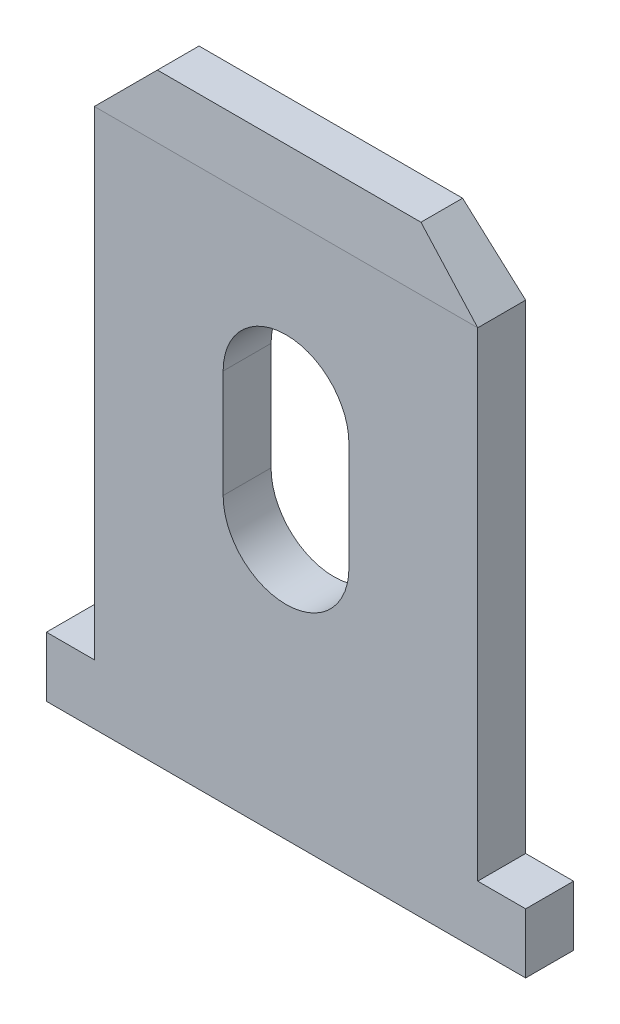
ISO-10303-21;
HEADER;
FILE_DESCRIPTION(('STEP AP214'),'2;1');
FILE_NAME('part.step','',(''),(''),'','','');
FILE_SCHEMA(('AUTOMOTIVE_DESIGN { 1 0 10303 214 1 1 1 1 }'));
ENDSEC;
DATA;
#1=APPLICATION_CONTEXT('core data for automotive mechanical design processes');
#2=APPLICATION_PROTOCOL_DEFINITION('international standard','automotive_design',2000,#1);
#3=PRODUCT_CONTEXT('',#1,'mechanical');
#4=PRODUCT('Part','Part','',(#3));
#5=PRODUCT_RELATED_PRODUCT_CATEGORY('part','',(#4));
#6=PRODUCT_DEFINITION_FORMATION('','',#4);
#7=PRODUCT_DEFINITION_CONTEXT('part definition',#1,'design');
#8=PRODUCT_DEFINITION('design','',#6,#7);
#9=PRODUCT_DEFINITION_SHAPE('','',#8);
#10=(LENGTH_UNIT() NAMED_UNIT(*) SI_UNIT(.MILLI.,.METRE.));
#11=(NAMED_UNIT(*) PLANE_ANGLE_UNIT() SI_UNIT($,.RADIAN.));
#12=(NAMED_UNIT(*) SI_UNIT($,.STERADIAN.) SOLID_ANGLE_UNIT());
#13=UNCERTAINTY_MEASURE_WITH_UNIT(LENGTH_MEASURE(1.E-05),#10,'distance_accuracy_value','');
#14=(GEOMETRIC_REPRESENTATION_CONTEXT(3) GLOBAL_UNCERTAINTY_ASSIGNED_CONTEXT((#13)) GLOBAL_UNIT_ASSIGNED_CONTEXT((#10,
#11,#12)) REPRESENTATION_CONTEXT('',''));
#15=CARTESIAN_POINT('',(0.,0.,0.));
#16=DIRECTION('',(0.,0.,1.));
#17=DIRECTION('',(1.,0.,0.));
#18=AXIS2_PLACEMENT_3D('',#15,#16,#17);
#19=CARTESIAN_POINT('',(0.,10.,-0.347592220716959));
#20=DIRECTION('',(0.,0.0523359562429405,-0.998629534754574));
#21=DIRECTION('',(0.,0.998629534754574,0.0523359562429405));
#22=AXIS2_PLACEMENT_3D('',#19,#20,#21);
#23=PLANE('',#22);
#24=DIRECTION('',(1.,0.,0.));
#25=VECTOR('',#24,1.);
#26=CARTESIAN_POINT('',(-4.,8.99999999999993,-0.4));
#27=LINE('',#26,#25);
#28=CARTESIAN_POINT('',(3.20000000000001,8.99999999999994,-0.4));
#29=VERTEX_POINT('',#28);
#30=CARTESIAN_POINT('',(-3.20000000000001,8.99999999999994,-0.4));
#31=VERTEX_POINT('',#30);
#32=EDGE_CURVE('E125',#29,#31,#27,.F.);
#33=ORIENTED_EDGE('',*,*,#32,.T.);
#34=DIRECTION('',(-0.706621750184623,-0.706621750184626,-0.037032476720271));
#35=VECTOR('',#34,1.);
#36=CARTESIAN_POINT('',(-2.2,10.,-0.347592220716959));
#37=LINE('',#36,#35);
#38=CARTESIAN_POINT('',(-2.2,10.,-0.347592220716959));
#39=VERTEX_POINT('',#38);
#40=EDGE_CURVE('E170',#39,#31,#37,.T.);
#41=ORIENTED_EDGE('',*,*,#40,.F.);
#42=DIRECTION('',(1.,0.,0.));
#43=VECTOR('',#42,1.);
#44=CARTESIAN_POINT('',(0.,10.,-0.347592220716959));
#45=LINE('',#44,#43);
#46=CARTESIAN_POINT('',(2.2,10.,-0.347592220716959));
#47=VERTEX_POINT('',#46);
#48=EDGE_CURVE('E145',#47,#39,#45,.F.);
#49=ORIENTED_EDGE('',*,*,#48,.F.);
#50=DIRECTION('',(-0.706621750184623,0.706621750184625,0.0370324767202709));
#51=VECTOR('',#50,1.);
#52=CARTESIAN_POINT('',(3.20000000000003,8.99999999999996,-0.4));
#53=LINE('',#52,#51);
#54=EDGE_CURVE('E166',#29,#47,#53,.T.);
#55=ORIENTED_EDGE('',*,*,#54,.F.);
#56=EDGE_LOOP('',(#33,#41,#49,#55));
#57=FACE_BOUND('',#56,.T.);
#58=ADVANCED_FACE('F17',(#57),#23,.T.);
#59=CARTESIAN_POINT('',(0.,10.,0.));
#60=DIRECTION('',(0.,1.,0.));
#61=DIRECTION('',(0.,0.,1.));
#62=AXIS2_PLACEMENT_3D('',#59,#60,#61);
#63=PLANE('',#62);
#64=ORIENTED_EDGE('',*,*,#48,.T.);
#65=DIRECTION('',(0.,0.,1.));
#66=VECTOR('',#65,1.);
#67=CARTESIAN_POINT('',(-2.2,10.,0.));
#68=LINE('',#67,#66);
#69=CARTESIAN_POINT('',(-2.2,10.,0.347592220716959));
#70=VERTEX_POINT('',#69);
#71=EDGE_CURVE('E168',#70,#39,#68,.F.);
#72=ORIENTED_EDGE('',*,*,#71,.F.);
#73=DIRECTION('',(1.,0.,0.));
#74=VECTOR('',#73,1.);
#75=CARTESIAN_POINT('',(0.,10.,0.347592220716959));
#76=LINE('',#75,#74);
#77=CARTESIAN_POINT('',(2.2,10.,0.347592220716959));
#78=VERTEX_POINT('',#77);
#79=EDGE_CURVE('E259',#78,#70,#76,.F.);
#80=ORIENTED_EDGE('',*,*,#79,.F.);
#81=DIRECTION('',(0.,0.,1.));
#82=VECTOR('',#81,1.);
#83=CARTESIAN_POINT('',(2.2,10.,0.));
#84=LINE('',#83,#82);
#85=EDGE_CURVE('E164',#47,#78,#84,.T.);
#86=ORIENTED_EDGE('',*,*,#85,.F.);
#87=EDGE_LOOP('',(#64,#72,#80,#86));
#88=FACE_BOUND('',#87,.T.);
#89=ADVANCED_FACE('F178',(#88),#63,.T.);
#90=CARTESIAN_POINT('',(-2.2,10.,0.));
#91=DIRECTION('',(-0.707106781186549,0.707106781186546,0.));
#92=DIRECTION('',(-0.707106781186546,-0.707106781186549,0.));
#93=AXIS2_PLACEMENT_3D('',#90,#91,#92);
#94=PLANE('',#93);
#95=DIRECTION('',(-0.706621750184602,-0.706621750184646,0.0370324767202708));
#96=VECTOR('',#95,1.);
#97=CARTESIAN_POINT('',(-2.2,10.,0.347592220716959));
#98=LINE('',#97,#96);
#99=CARTESIAN_POINT('',(-3.20000000000001,8.99999999999995,0.4));
#100=VERTEX_POINT('',#99);
#101=EDGE_CURVE('E184',#70,#100,#98,.T.);
#102=ORIENTED_EDGE('',*,*,#101,.F.);
#103=ORIENTED_EDGE('',*,*,#71,.T.);
#104=ORIENTED_EDGE('',*,*,#40,.T.);
#105=DIRECTION('',(0.,0.,-1.));
#106=VECTOR('',#105,1.);
#107=CARTESIAN_POINT('',(-3.2,8.99999999999994,-0.4));
#108=LINE('',#107,#106);
#109=EDGE_CURVE('E192',#31,#100,#108,.F.);
#110=ORIENTED_EDGE('',*,*,#109,.T.);
#111=EDGE_LOOP('',(#102,#103,#104,#110));
#112=FACE_BOUND('',#111,.T.);
#113=ADVANCED_FACE('F183',(#112),#94,.T.);
#114=CARTESIAN_POINT('',(2.2,10.,0.));
#115=DIRECTION('',(0.707106781186549,0.707106781186546,0.));
#116=DIRECTION('',(-0.707106781186546,0.707106781186549,0.));
#117=AXIS2_PLACEMENT_3D('',#114,#115,#116);
#118=PLANE('',#117);
#119=ORIENTED_EDGE('',*,*,#54,.T.);
#120=ORIENTED_EDGE('',*,*,#85,.T.);
#121=DIRECTION('',(-0.706621750184601,0.706621750184647,-0.0370324767202708));
#122=VECTOR('',#121,1.);
#123=CARTESIAN_POINT('',(3.2,8.99999999999993,0.4));
#124=LINE('',#123,#122);
#125=CARTESIAN_POINT('',(3.20000000000001,8.99999999999995,0.4));
#126=VERTEX_POINT('',#125);
#127=EDGE_CURVE('E199',#126,#78,#124,.T.);
#128=ORIENTED_EDGE('',*,*,#127,.F.);
#129=DIRECTION('',(0.,0.,1.));
#130=VECTOR('',#129,1.);
#131=CARTESIAN_POINT('',(3.2,8.99999999999993,-0.4));
#132=LINE('',#131,#130);
#133=EDGE_CURVE('E34',#126,#29,#132,.F.);
#134=ORIENTED_EDGE('',*,*,#133,.T.);
#135=EDGE_LOOP('',(#119,#120,#128,#134));
#136=FACE_BOUND('',#135,.T.);
#137=ADVANCED_FACE('F265',(#136),#118,.T.);
#138=CARTESIAN_POINT('',(-4.,1.,-0.4));
#139=DIRECTION('',(0.,0.,1.));
#140=DIRECTION('',(1.,0.,0.));
#141=AXIS2_PLACEMENT_3D('',#138,#139,#140);
#142=PLANE('',#141);
#143=ORIENTED_EDGE('',*,*,#32,.F.);
#144=DIRECTION('',(0.,1.,0.));
#145=VECTOR('',#144,1.);
#146=CARTESIAN_POINT('',(3.2,10.,-0.4));
#147=LINE('',#146,#145);
#148=CARTESIAN_POINT('',(3.2,1.,-0.4));
#149=VERTEX_POINT('',#148);
#150=EDGE_CURVE('E155',#29,#149,#147,.F.);
#151=ORIENTED_EDGE('',*,*,#150,.T.);
#152=DIRECTION('',(1.,0.,0.));
#153=VECTOR('',#152,1.);
#154=CARTESIAN_POINT('',(0.,1.,-0.4));
#155=LINE('',#154,#153);
#156=CARTESIAN_POINT('',(4.,1.,-0.4));
#157=VERTEX_POINT('',#156);
#158=EDGE_CURVE('E138',#157,#149,#155,.F.);
#159=ORIENTED_EDGE('',*,*,#158,.F.);
#160=DIRECTION('',(0.,1.,0.));
#161=VECTOR('',#160,1.);
#162=CARTESIAN_POINT('',(4.,1.,-0.4));
#163=LINE('',#162,#161);
#164=CARTESIAN_POINT('',(4.,0.,-0.4));
#165=VERTEX_POINT('',#164);
#166=EDGE_CURVE('E222',#157,#165,#163,.F.);
#167=ORIENTED_EDGE('',*,*,#166,.T.);
#168=DIRECTION('',(1.,0.,0.));
#169=VECTOR('',#168,1.);
#170=CARTESIAN_POINT('',(0.,0.,-0.4));
#171=LINE('',#170,#169);
#172=CARTESIAN_POINT('',(-4.,0.,-0.4));
#173=VERTEX_POINT('',#172);
#174=EDGE_CURVE('E219',#165,#173,#171,.F.);
#175=ORIENTED_EDGE('',*,*,#174,.T.);
#176=DIRECTION('',(0.,1.,0.));
#177=VECTOR('',#176,1.);
#178=CARTESIAN_POINT('',(-4.,1.,-0.4));
#179=LINE('',#178,#177);
#180=CARTESIAN_POINT('',(-4.,1.,-0.4));
#181=VERTEX_POINT('',#180);
#182=EDGE_CURVE('E214',#173,#181,#179,.T.);
#183=ORIENTED_EDGE('',*,*,#182,.T.);
#184=DIRECTION('',(1.,0.,0.));
#185=VECTOR('',#184,1.);
#186=CARTESIAN_POINT('',(0.,1.,-0.4));
#187=LINE('',#186,#185);
#188=CARTESIAN_POINT('',(-3.2,1.,-0.4));
#189=VERTEX_POINT('',#188);
#190=EDGE_CURVE('E202',#189,#181,#187,.F.);
#191=ORIENTED_EDGE('',*,*,#190,.F.);
#192=DIRECTION('',(0.,1.,0.));
#193=VECTOR('',#192,1.);
#194=CARTESIAN_POINT('',(-3.2,10.,-0.4));
#195=LINE('',#194,#193);
#196=EDGE_CURVE('E194',#189,#31,#195,.T.);
#197=ORIENTED_EDGE('',*,*,#196,.T.);
#198=EDGE_LOOP('',(#143,#151,#159,#167,#175,#183,#191,#197));
#199=FACE_BOUND('',#198,.T.);
#200=CARTESIAN_POINT('',(0.,4.45,-0.4));
#201=DIRECTION('',(0.,0.,1.));
#202=DIRECTION('',(1.,0.,0.));
#203=AXIS2_PLACEMENT_3D('',#200,#201,#202);
#204=CIRCLE('',#203,1.05);
#205=CARTESIAN_POINT('',(-1.05,4.45,-0.4));
#206=VERTEX_POINT('',#205);
#207=CARTESIAN_POINT('',(1.05,4.45,-0.4));
#208=VERTEX_POINT('',#207);
#209=EDGE_CURVE('E134',#206,#208,#204,.T.);
#210=ORIENTED_EDGE('',*,*,#209,.T.);
#211=DIRECTION('',(0.,1.,0.));
#212=VECTOR('',#211,1.);
#213=CARTESIAN_POINT('',(1.05,6.25,-0.4));
#214=LINE('',#213,#212);
#215=CARTESIAN_POINT('',(1.05,6.25,-0.4));
#216=VERTEX_POINT('',#215);
#217=EDGE_CURVE('E129',#208,#216,#214,.T.);
#218=ORIENTED_EDGE('',*,*,#217,.T.);
#219=CARTESIAN_POINT('',(0.,6.25,-0.4));
#220=DIRECTION('',(0.,0.,1.));
#221=DIRECTION('',(1.,0.,0.));
#222=AXIS2_PLACEMENT_3D('',#219,#220,#221);
#223=CIRCLE('',#222,1.05);
#224=CARTESIAN_POINT('',(-1.05,6.25,-0.4));
#225=VERTEX_POINT('',#224);
#226=EDGE_CURVE('E20',#216,#225,#223,.T.);
#227=ORIENTED_EDGE('',*,*,#226,.T.);
#228=DIRECTION('',(0.,1.,0.));
#229=VECTOR('',#228,1.);
#230=CARTESIAN_POINT('',(-1.05,6.25,-0.4));
#231=LINE('',#230,#229);
#232=EDGE_CURVE('E147',#225,#206,#231,.F.);
#233=ORIENTED_EDGE('',*,*,#232,.T.);
#234=EDGE_LOOP('',(#210,#218,#227,#233));
#235=FACE_BOUND('',#234,.T.);
#236=ADVANCED_FACE('F136',(#199,#235),#142,.F.);
#237=CARTESIAN_POINT('',(0.,6.25,-0.40105));
#238=DIRECTION('',(0.,0.,1.));
#239=DIRECTION('',(1.,0.,0.));
#240=AXIS2_PLACEMENT_3D('',#237,#238,#239);
#241=CYLINDRICAL_SURFACE('',#240,1.05);
#242=DIRECTION('',(0.,0.,1.));
#243=VECTOR('',#242,1.);
#244=CARTESIAN_POINT('',(1.05,6.25,-0.40105));
#245=LINE('',#244,#243);
#246=CARTESIAN_POINT('',(1.05,6.25,0.4));
#247=VERTEX_POINT('',#246);
#248=EDGE_CURVE('E119',#216,#247,#245,.T.);
#249=ORIENTED_EDGE('',*,*,#248,.T.);
#250=CARTESIAN_POINT('',(0.,6.25,0.4));
#251=DIRECTION('',(0.,0.,1.));
#252=DIRECTION('',(1.,0.,0.));
#253=AXIS2_PLACEMENT_3D('',#250,#251,#252);
#254=CIRCLE('',#253,1.05);
#255=CARTESIAN_POINT('',(-1.05,6.25,0.4));
#256=VERTEX_POINT('',#255);
#257=EDGE_CURVE('E154',#247,#256,#254,.T.);
#258=ORIENTED_EDGE('',*,*,#257,.T.);
#259=DIRECTION('',(0.,0.,1.));
#260=VECTOR('',#259,1.);
#261=CARTESIAN_POINT('',(-1.05,6.25,-0.40105));
#262=LINE('',#261,#260);
#263=EDGE_CURVE('E121',#256,#225,#262,.F.);
#264=ORIENTED_EDGE('',*,*,#263,.T.);
#265=ORIENTED_EDGE('',*,*,#226,.F.);
#266=EDGE_LOOP('',(#249,#258,#264,#265));
#267=FACE_BOUND('',#266,.T.);
#268=ADVANCED_FACE('F117',(#267),#241,.F.);
#269=CARTESIAN_POINT('',(-1.05,6.25,-0.40105));
#270=DIRECTION('',(-1.,0.,0.));
#271=DIRECTION('',(0.,0.,1.));
#272=AXIS2_PLACEMENT_3D('',#269,#270,#271);
#273=PLANE('',#272);
#274=ORIENTED_EDGE('',*,*,#263,.F.);
#275=DIRECTION('',(0.,1.,0.));
#276=VECTOR('',#275,1.);
#277=CARTESIAN_POINT('',(-1.05,1.,0.4));
#278=LINE('',#277,#276);
#279=CARTESIAN_POINT('',(-1.05,4.45,0.4));
#280=VERTEX_POINT('',#279);
#281=EDGE_CURVE('E153',#256,#280,#278,.F.);
#282=ORIENTED_EDGE('',*,*,#281,.T.);
#283=DIRECTION('',(0.,0.,1.));
#284=VECTOR('',#283,1.);
#285=CARTESIAN_POINT('',(-1.05,4.45,-0.40105));
#286=LINE('',#285,#284);
#287=EDGE_CURVE('E149',#280,#206,#286,.F.);
#288=ORIENTED_EDGE('',*,*,#287,.T.);
#289=ORIENTED_EDGE('',*,*,#232,.F.);
#290=EDGE_LOOP('',(#274,#282,#288,#289));
#291=FACE_BOUND('',#290,.T.);
#292=ADVANCED_FACE('F371',(#291),#273,.F.);
#293=CARTESIAN_POINT('',(0.,4.45,-0.40105));
#294=DIRECTION('',(0.,0.,1.));
#295=DIRECTION('',(1.,0.,0.));
#296=AXIS2_PLACEMENT_3D('',#293,#294,#295);
#297=CYLINDRICAL_SURFACE('',#296,1.05);
#298=ORIENTED_EDGE('',*,*,#287,.F.);
#299=CARTESIAN_POINT('',(0.,4.45,0.4));
#300=DIRECTION('',(0.,0.,1.));
#301=DIRECTION('',(1.,0.,0.));
#302=AXIS2_PLACEMENT_3D('',#299,#300,#301);
#303=CIRCLE('',#302,1.05);
#304=CARTESIAN_POINT('',(1.05,4.45,0.4));
#305=VERTEX_POINT('',#304);
#306=EDGE_CURVE('E150',#280,#305,#303,.T.);
#307=ORIENTED_EDGE('',*,*,#306,.T.);
#308=DIRECTION('',(0.,0.,1.));
#309=VECTOR('',#308,1.);
#310=CARTESIAN_POINT('',(1.05,4.45,-0.40105));
#311=LINE('',#310,#309);
#312=EDGE_CURVE('E133',#305,#208,#311,.F.);
#313=ORIENTED_EDGE('',*,*,#312,.T.);
#314=ORIENTED_EDGE('',*,*,#209,.F.);
#315=EDGE_LOOP('',(#298,#307,#313,#314));
#316=FACE_BOUND('',#315,.T.);
#317=ADVANCED_FACE('F363',(#316),#297,.F.);
#318=CARTESIAN_POINT('',(1.05,6.25,-0.40105));
#319=DIRECTION('',(1.,0.,0.));
#320=DIRECTION('',(0.,1.,0.));
#321=AXIS2_PLACEMENT_3D('',#318,#319,#320);
#322=PLANE('',#321);
#323=ORIENTED_EDGE('',*,*,#312,.F.);
#324=DIRECTION('',(0.,1.,0.));
#325=VECTOR('',#324,1.);
#326=CARTESIAN_POINT('',(1.05,1.,0.4));
#327=LINE('',#326,#325);
#328=EDGE_CURVE('E132',#305,#247,#327,.T.);
#329=ORIENTED_EDGE('',*,*,#328,.T.);
#330=ORIENTED_EDGE('',*,*,#248,.F.);
#331=ORIENTED_EDGE('',*,*,#217,.F.);
#332=EDGE_LOOP('',(#323,#329,#330,#331));
#333=FACE_BOUND('',#332,.T.);
#334=ADVANCED_FACE('F128',(#333),#322,.F.);
#335=CARTESIAN_POINT('',(0.,1.,0.));
#336=DIRECTION('',(0.,1.,0.));
#337=DIRECTION('',(0.,0.,1.));
#338=AXIS2_PLACEMENT_3D('',#335,#336,#337);
#339=PLANE('',#338);
#340=DIRECTION('',(0.,0.,1.));
#341=VECTOR('',#340,1.);
#342=CARTESIAN_POINT('',(4.,1.,-0.4));
#343=LINE('',#342,#341);
#344=CARTESIAN_POINT('',(4.,1.,0.4));
#345=VERTEX_POINT('',#344);
#346=EDGE_CURVE('E140',#345,#157,#343,.F.);
#347=ORIENTED_EDGE('',*,*,#346,.T.);
#348=ORIENTED_EDGE('',*,*,#158,.T.);
#349=DIRECTION('',(0.,0.,1.));
#350=VECTOR('',#349,1.);
#351=CARTESIAN_POINT('',(3.2,1.,-0.4));
#352=LINE('',#351,#350);
#353=CARTESIAN_POINT('',(3.2,1.,0.4));
#354=VERTEX_POINT('',#353);
#355=EDGE_CURVE('E256',#149,#354,#352,.T.);
#356=ORIENTED_EDGE('',*,*,#355,.T.);
#357=DIRECTION('',(-1.,0.,0.));
#358=VECTOR('',#357,1.);
#359=CARTESIAN_POINT('',(-4.,1.,0.4));
#360=LINE('',#359,#358);
#361=EDGE_CURVE('E231',#354,#345,#360,.F.);
#362=ORIENTED_EDGE('',*,*,#361,.T.);
#363=EDGE_LOOP('',(#347,#348,#356,#362));
#364=FACE_BOUND('',#363,.T.);
#365=ADVANCED_FACE('F228',(#364),#339,.T.);
#366=CARTESIAN_POINT('',(4.,1.,-0.4));
#367=DIRECTION('',(-1.,0.,0.));
#368=DIRECTION('',(0.,0.,1.));
#369=AXIS2_PLACEMENT_3D('',#366,#367,#368);
#370=PLANE('',#369);
#371=ORIENTED_EDGE('',*,*,#166,.F.);
#372=ORIENTED_EDGE('',*,*,#346,.F.);
#373=DIRECTION('',(0.,1.,0.));
#374=VECTOR('',#373,1.);
#375=CARTESIAN_POINT('',(4.,1.,0.4));
#376=LINE('',#375,#374);
#377=CARTESIAN_POINT('',(4.,0.,0.4));
#378=VERTEX_POINT('',#377);
#379=EDGE_CURVE('E237',#345,#378,#376,.F.);
#380=ORIENTED_EDGE('',*,*,#379,.T.);
#381=DIRECTION('',(0.,0.,1.));
#382=VECTOR('',#381,1.);
#383=CARTESIAN_POINT('',(4.,0.,0.));
#384=LINE('',#383,#382);
#385=EDGE_CURVE('E216',#378,#165,#384,.F.);
#386=ORIENTED_EDGE('',*,*,#385,.T.);
#387=EDGE_LOOP('',(#371,#372,#380,#386));
#388=FACE_BOUND('',#387,.T.);
#389=ADVANCED_FACE('F236',(#388),#370,.F.);
#390=CARTESIAN_POINT('',(0.,0.,0.));
#391=DIRECTION('',(0.,1.,0.));
#392=DIRECTION('',(0.,0.,1.));
#393=AXIS2_PLACEMENT_3D('',#390,#391,#392);
#394=PLANE('',#393);
#395=DIRECTION('',(-1.,0.,0.));
#396=VECTOR('',#395,1.);
#397=CARTESIAN_POINT('',(-4.,0.,0.4));
#398=LINE('',#397,#396);
#399=CARTESIAN_POINT('',(-4.,0.,0.4));
#400=VERTEX_POINT('',#399);
#401=EDGE_CURVE('E245',#378,#400,#398,.T.);
#402=ORIENTED_EDGE('',*,*,#401,.T.);
#403=DIRECTION('',(0.,0.,-1.));
#404=VECTOR('',#403,1.);
#405=CARTESIAN_POINT('',(-4.,0.,-0.4));
#406=LINE('',#405,#404);
#407=EDGE_CURVE('E211',#400,#173,#406,.T.);
#408=ORIENTED_EDGE('',*,*,#407,.T.);
#409=ORIENTED_EDGE('',*,*,#174,.F.);
#410=ORIENTED_EDGE('',*,*,#385,.F.);
#411=EDGE_LOOP('',(#402,#408,#409,#410));
#412=FACE_BOUND('',#411,.T.);
#413=ADVANCED_FACE('F268',(#412),#394,.F.);
#414=CARTESIAN_POINT('',(-4.,1.,-0.4));
#415=DIRECTION('',(1.,0.,0.));
#416=DIRECTION('',(0.,0.,-1.));
#417=AXIS2_PLACEMENT_3D('',#414,#415,#416);
#418=PLANE('',#417);
#419=DIRECTION('',(0.,1.,0.));
#420=VECTOR('',#419,1.);
#421=CARTESIAN_POINT('',(-4.,1.,0.4));
#422=LINE('',#421,#420);
#423=CARTESIAN_POINT('',(-4.,1.,0.4));
#424=VERTEX_POINT('',#423);
#425=EDGE_CURVE('E247',#400,#424,#422,.T.);
#426=ORIENTED_EDGE('',*,*,#425,.T.);
#427=DIRECTION('',(0.,0.,1.));
#428=VECTOR('',#427,1.);
#429=CARTESIAN_POINT('',(-4.,1.,0.));
#430=LINE('',#429,#428);
#431=EDGE_CURVE('E205',#181,#424,#430,.T.);
#432=ORIENTED_EDGE('',*,*,#431,.F.);
#433=ORIENTED_EDGE('',*,*,#182,.F.);
#434=ORIENTED_EDGE('',*,*,#407,.F.);
#435=EDGE_LOOP('',(#426,#432,#433,#434));
#436=FACE_BOUND('',#435,.T.);
#437=ADVANCED_FACE('F271',(#436),#418,.F.);
#438=CARTESIAN_POINT('',(0.,1.,0.));
#439=DIRECTION('',(0.,1.,0.));
#440=DIRECTION('',(0.,0.,1.));
#441=AXIS2_PLACEMENT_3D('',#438,#439,#440);
#442=PLANE('',#441);
#443=ORIENTED_EDGE('',*,*,#431,.T.);
#444=DIRECTION('',(-1.,0.,0.));
#445=VECTOR('',#444,1.);
#446=CARTESIAN_POINT('',(-4.,1.,0.4));
#447=LINE('',#446,#445);
#448=CARTESIAN_POINT('',(-3.2,1.,0.4));
#449=VERTEX_POINT('',#448);
#450=EDGE_CURVE('E275',#424,#449,#447,.F.);
#451=ORIENTED_EDGE('',*,*,#450,.T.);
#452=DIRECTION('',(0.,0.,-1.));
#453=VECTOR('',#452,1.);
#454=CARTESIAN_POINT('',(-3.2,1.,-0.4));
#455=LINE('',#454,#453);
#456=EDGE_CURVE('E203',#449,#189,#455,.T.);
#457=ORIENTED_EDGE('',*,*,#456,.T.);
#458=ORIENTED_EDGE('',*,*,#190,.T.);
#459=EDGE_LOOP('',(#443,#451,#457,#458));
#460=FACE_BOUND('',#459,.T.);
#461=ADVANCED_FACE('F280',(#460),#442,.T.);
#462=CARTESIAN_POINT('',(-3.2,10.,-0.4));
#463=DIRECTION('',(1.,0.,0.));
#464=DIRECTION('',(0.,0.,-1.));
#465=AXIS2_PLACEMENT_3D('',#462,#463,#464);
#466=PLANE('',#465);
#467=ORIENTED_EDGE('',*,*,#109,.F.);
#468=ORIENTED_EDGE('',*,*,#196,.F.);
#469=ORIENTED_EDGE('',*,*,#456,.F.);
#470=DIRECTION('',(0.,1.,0.));
#471=VECTOR('',#470,1.);
#472=CARTESIAN_POINT('',(-3.2,1.,0.4));
#473=LINE('',#472,#471);
#474=EDGE_CURVE('E197',#449,#100,#473,.T.);
#475=ORIENTED_EDGE('',*,*,#474,.T.);
#476=EDGE_LOOP('',(#467,#468,#469,#475));
#477=FACE_BOUND('',#476,.T.);
#478=ADVANCED_FACE('F193',(#477),#466,.F.);
#479=CARTESIAN_POINT('',(0.,10.,0.347592220716959));
#480=DIRECTION('',(0.,0.0523359562429404,0.998629534754574));
#481=DIRECTION('',(0.,-0.998629534754574,0.0523359562429404));
#482=AXIS2_PLACEMENT_3D('',#479,#480,#481);
#483=PLANE('',#482);
#484=ORIENTED_EDGE('',*,*,#79,.T.);
#485=ORIENTED_EDGE('',*,*,#101,.T.);
#486=DIRECTION('',(-1.,0.,0.));
#487=VECTOR('',#486,1.);
#488=CARTESIAN_POINT('',(-4.,8.99999999999993,0.4));
#489=LINE('',#488,#487);
#490=EDGE_CURVE('E26',#100,#126,#489,.F.);
#491=ORIENTED_EDGE('',*,*,#490,.T.);
#492=ORIENTED_EDGE('',*,*,#127,.T.);
#493=EDGE_LOOP('',(#484,#485,#491,#492));
#494=FACE_BOUND('',#493,.T.);
#495=ADVANCED_FACE('F263',(#494),#483,.T.);
#496=CARTESIAN_POINT('',(3.2,10.,-0.4));
#497=DIRECTION('',(-1.,0.,0.));
#498=DIRECTION('',(0.,0.,1.));
#499=AXIS2_PLACEMENT_3D('',#496,#497,#498);
#500=PLANE('',#499);
#501=ORIENTED_EDGE('',*,*,#133,.F.);
#502=DIRECTION('',(0.,1.,0.));
#503=VECTOR('',#502,1.);
#504=CARTESIAN_POINT('',(3.2,1.,0.4));
#505=LINE('',#504,#503);
#506=EDGE_CURVE('E11',#126,#354,#505,.F.);
#507=ORIENTED_EDGE('',*,*,#506,.T.);
#508=ORIENTED_EDGE('',*,*,#355,.F.);
#509=ORIENTED_EDGE('',*,*,#150,.F.);
#510=EDGE_LOOP('',(#501,#507,#508,#509));
#511=FACE_BOUND('',#510,.T.);
#512=ADVANCED_FACE('F266',(#511),#500,.F.);
#513=CARTESIAN_POINT('',(-4.,1.,0.4));
#514=DIRECTION('',(0.,0.,-1.));
#515=DIRECTION('',(-1.,0.,0.));
#516=AXIS2_PLACEMENT_3D('',#513,#514,#515);
#517=PLANE('',#516);
#518=ORIENTED_EDGE('',*,*,#490,.F.);
#519=ORIENTED_EDGE('',*,*,#474,.F.);
#520=ORIENTED_EDGE('',*,*,#450,.F.);
#521=ORIENTED_EDGE('',*,*,#425,.F.);
#522=ORIENTED_EDGE('',*,*,#401,.F.);
#523=ORIENTED_EDGE('',*,*,#379,.F.);
#524=ORIENTED_EDGE('',*,*,#361,.F.);
#525=ORIENTED_EDGE('',*,*,#506,.F.);
#526=EDGE_LOOP('',(#518,#519,#520,#521,#522,#523,#524,#525));
#527=FACE_BOUND('',#526,.T.);
#528=ORIENTED_EDGE('',*,*,#306,.F.);
#529=ORIENTED_EDGE('',*,*,#281,.F.);
#530=ORIENTED_EDGE('',*,*,#257,.F.);
#531=ORIENTED_EDGE('',*,*,#328,.F.);
#532=EDGE_LOOP('',(#528,#529,#530,#531));
#533=FACE_BOUND('',#532,.T.);
#534=ADVANCED_FACE('F240',(#527,#533),#517,.F.);
#535=CLOSED_SHELL('',(#58,#89,#113,#137,#236,#268,#292,#317,#334,#365,#389,#413,#437,#461,#478,
#495,#512,#534));
#536=MANIFOLD_SOLID_BREP('B1',#535);
#537=ADVANCED_BREP_SHAPE_REPRESENTATION('',(#18,#536),#14);
#538=SHAPE_DEFINITION_REPRESENTATION(#9,#537);
ENDSEC;
END-ISO-10303-21;
